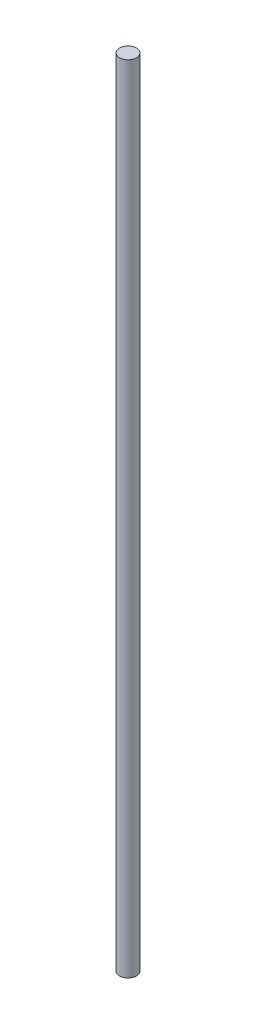
ISO-10303-21;
HEADER;
FILE_DESCRIPTION(('STEP AP214'),'2;1');
FILE_NAME('part.step','',(''),(''),'','','');
FILE_SCHEMA(('AUTOMOTIVE_DESIGN { 1 0 10303 214 1 1 1 1 }'));
ENDSEC;
DATA;
#1=APPLICATION_CONTEXT('core data for automotive mechanical design processes');
#2=APPLICATION_PROTOCOL_DEFINITION('international standard','automotive_design',2000,#1);
#3=PRODUCT_CONTEXT('',#1,'mechanical');
#4=PRODUCT('Part','Part','',(#3));
#5=PRODUCT_RELATED_PRODUCT_CATEGORY('part','',(#4));
#6=PRODUCT_DEFINITION_FORMATION('','',#4);
#7=PRODUCT_DEFINITION_CONTEXT('part definition',#1,'design');
#8=PRODUCT_DEFINITION('design','',#6,#7);
#9=PRODUCT_DEFINITION_SHAPE('','',#8);
#10=(LENGTH_UNIT() NAMED_UNIT(*) SI_UNIT(.MILLI.,.METRE.));
#11=(NAMED_UNIT(*) PLANE_ANGLE_UNIT() SI_UNIT($,.RADIAN.));
#12=(NAMED_UNIT(*) SI_UNIT($,.STERADIAN.) SOLID_ANGLE_UNIT());
#13=UNCERTAINTY_MEASURE_WITH_UNIT(LENGTH_MEASURE(1.E-05),#10,'distance_accuracy_value','');
#14=(GEOMETRIC_REPRESENTATION_CONTEXT(3) GLOBAL_UNCERTAINTY_ASSIGNED_CONTEXT((#13)) GLOBAL_UNIT_ASSIGNED_CONTEXT((#10,
#11,#12)) REPRESENTATION_CONTEXT('',''));
#15=CARTESIAN_POINT('',(0.,0.,0.));
#16=DIRECTION('',(0.,0.,1.));
#17=DIRECTION('',(1.,0.,0.));
#18=AXIS2_PLACEMENT_3D('',#15,#16,#17);
#19=CARTESIAN_POINT('',(0.,596.9,0.));
#20=DIRECTION('',(0.,-1.,0.));
#21=DIRECTION('',(0.,0.,-1.));
#22=AXIS2_PLACEMENT_3D('',#19,#20,#21);
#23=CYLINDRICAL_SURFACE('',#22,6.35);
#24=CARTESIAN_POINT('',(0.,596.9,0.));
#25=DIRECTION('',(0.,1.,0.));
#26=DIRECTION('',(0.,0.,1.));
#27=AXIS2_PLACEMENT_3D('',#24,#25,#26);
#28=CIRCLE('',#27,6.35);
#29=CARTESIAN_POINT('',(0.,596.9,6.35));
#30=VERTEX_POINT('',#29);
#31=EDGE_CURVE('E10',#30,#30,#28,.T.);
#32=ORIENTED_EDGE('',*,*,#31,.F.);
#33=EDGE_LOOP('',(#32));
#34=FACE_BOUND('',#33,.T.);
#35=CARTESIAN_POINT('',(0.,0.,0.));
#36=DIRECTION('',(0.,1.,0.));
#37=DIRECTION('',(0.,0.,1.));
#38=AXIS2_PLACEMENT_3D('',#35,#36,#37);
#39=CIRCLE('',#38,6.35);
#40=CARTESIAN_POINT('',(0.,0.,6.35));
#41=VERTEX_POINT('',#40);
#42=EDGE_CURVE('E34',#41,#41,#39,.T.);
#43=ORIENTED_EDGE('',*,*,#42,.T.);
#44=EDGE_LOOP('',(#43));
#45=FACE_BOUND('',#44,.T.);
#46=ADVANCED_FACE('F31',(#34,#45),#23,.T.);
#47=CARTESIAN_POINT('',(0.,596.9,0.));
#48=DIRECTION('',(0.,1.,0.));
#49=DIRECTION('',(0.,0.,1.));
#50=AXIS2_PLACEMENT_3D('',#47,#48,#49);
#51=PLANE('',#50);
#52=ORIENTED_EDGE('',*,*,#31,.T.);
#53=EDGE_LOOP('',(#52));
#54=FACE_BOUND('',#53,.T.);
#55=ADVANCED_FACE('F46',(#54),#51,.T.);
#56=CARTESIAN_POINT('',(0.,0.,0.));
#57=DIRECTION('',(0.,1.,0.));
#58=DIRECTION('',(0.,0.,1.));
#59=AXIS2_PLACEMENT_3D('',#56,#57,#58);
#60=PLANE('',#59);
#61=ORIENTED_EDGE('',*,*,#42,.F.);
#62=EDGE_LOOP('',(#61));
#63=FACE_BOUND('',#62,.T.);
#64=ADVANCED_FACE('F44',(#63),#60,.F.);
#65=CLOSED_SHELL('',(#46,#55,#64));
#66=MANIFOLD_SOLID_BREP('B2',#65);
#67=ADVANCED_BREP_SHAPE_REPRESENTATION('',(#18,#66),#14);
#68=SHAPE_DEFINITION_REPRESENTATION(#9,#67);
ENDSEC;
END-ISO-10303-21;
